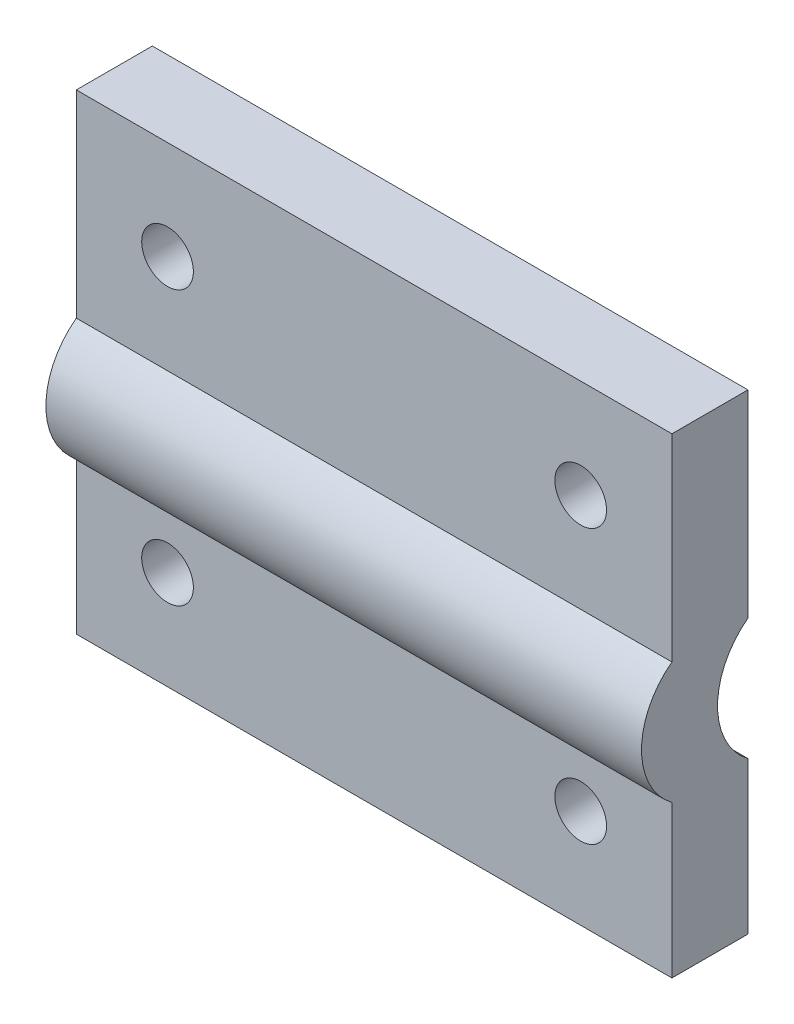
ISO-10303-21;
HEADER;
FILE_DESCRIPTION(('STEP AP214'),'2;1');
FILE_NAME('part.step','',(''),(''),'','','');
FILE_SCHEMA(('AUTOMOTIVE_DESIGN { 1 0 10303 214 1 1 1 1 }'));
ENDSEC;
DATA;
#1=APPLICATION_CONTEXT('core data for automotive mechanical design processes');
#2=APPLICATION_PROTOCOL_DEFINITION('international standard','automotive_design',2000,#1);
#3=PRODUCT_CONTEXT('',#1,'mechanical');
#4=PRODUCT('Part','Part','',(#3));
#5=PRODUCT_RELATED_PRODUCT_CATEGORY('part','',(#4));
#6=PRODUCT_DEFINITION_FORMATION('','',#4);
#7=PRODUCT_DEFINITION_CONTEXT('part definition',#1,'design');
#8=PRODUCT_DEFINITION('design','',#6,#7);
#9=PRODUCT_DEFINITION_SHAPE('','',#8);
#10=(LENGTH_UNIT() NAMED_UNIT(*) SI_UNIT(.MILLI.,.METRE.));
#11=(NAMED_UNIT(*) PLANE_ANGLE_UNIT() SI_UNIT($,.RADIAN.));
#12=(NAMED_UNIT(*) SI_UNIT($,.STERADIAN.) SOLID_ANGLE_UNIT());
#13=UNCERTAINTY_MEASURE_WITH_UNIT(LENGTH_MEASURE(1.E-05),#10,'distance_accuracy_value','');
#14=(GEOMETRIC_REPRESENTATION_CONTEXT(3) GLOBAL_UNCERTAINTY_ASSIGNED_CONTEXT((#13)) GLOBAL_UNIT_ASSIGNED_CONTEXT((#10,
#11,#12)) REPRESENTATION_CONTEXT('',''));
#15=CARTESIAN_POINT('',(0.,0.,0.));
#16=DIRECTION('',(0.,0.,1.));
#17=DIRECTION('',(1.,0.,0.));
#18=AXIS2_PLACEMENT_3D('',#15,#16,#17);
#19=CARTESIAN_POINT('',(-20.5399999999997,0.,5.));
#20=DIRECTION('',(1.,0.,0.));
#21=DIRECTION('',(0.,1.,0.));
#22=AXIS2_PLACEMENT_3D('',#19,#20,#21);
#23=PLANE('',#22);
#24=DIRECTION('',(0.,-1.,0.));
#25=VECTOR('',#24,1.);
#26=CARTESIAN_POINT('',(-20.5399999999997,0.,0.));
#27=LINE('',#26,#25);
#28=CARTESIAN_POINT('',(-20.5399999999997,52.1440002712051,0.));
#29=VERTEX_POINT('',#28);
#30=CARTESIAN_POINT('',(-20.5399999999997,39.1440002712051,0.));
#31=VERTEX_POINT('',#30);
#32=EDGE_CURVE('E20',#29,#31,#27,.T.);
#33=ORIENTED_EDGE('',*,*,#32,.T.);
#34=CARTESIAN_POINT('',(-20.5399999999997,35.144000271205,-3.));
#35=DIRECTION('',(-1.,0.,0.));
#36=DIRECTION('',(0.,-1.,0.));
#37=AXIS2_PLACEMENT_3D('',#34,#35,#36);
#38=CIRCLE('',#37,5.);
#39=CARTESIAN_POINT('',(-20.5399999999997,31.144000271205,0.));
#40=VERTEX_POINT('',#39);
#41=EDGE_CURVE('E110',#31,#40,#38,.F.);
#42=ORIENTED_EDGE('',*,*,#41,.T.);
#43=DIRECTION('',(0.,-1.,0.));
#44=VECTOR('',#43,1.);
#45=CARTESIAN_POINT('',(-20.5399999999997,0.,0.));
#46=LINE('',#45,#44);
#47=CARTESIAN_POINT('',(-20.5399999999997,21.1440002712051,0.));
#48=VERTEX_POINT('',#47);
#49=EDGE_CURVE('E299',#40,#48,#46,.T.);
#50=ORIENTED_EDGE('',*,*,#49,.T.);
#51=DIRECTION('',(0.,0.,-1.));
#52=VECTOR('',#51,1.);
#53=CARTESIAN_POINT('',(-20.5399999999997,21.1440002712051,5.));
#54=LINE('',#53,#52);
#55=CARTESIAN_POINT('',(-20.5399999999997,21.1440002712051,5.));
#56=VERTEX_POINT('',#55);
#57=EDGE_CURVE('E104',#56,#48,#54,.T.);
#58=ORIENTED_EDGE('',*,*,#57,.F.);
#59=DIRECTION('',(0.,-1.,0.));
#60=VECTOR('',#59,1.);
#61=CARTESIAN_POINT('',(-20.5399999999997,0.,5.));
#62=LINE('',#61,#60);
#63=CARTESIAN_POINT('',(-20.5399999999997,31.144000271205,5.));
#64=VERTEX_POINT('',#63);
#65=EDGE_CURVE('E87',#64,#56,#62,.T.);
#66=ORIENTED_EDGE('',*,*,#65,.F.);
#67=CARTESIAN_POINT('',(-20.5399999999997,35.144000271205,2.));
#68=DIRECTION('',(-1.,0.,0.));
#69=DIRECTION('',(0.,-1.,0.));
#70=AXIS2_PLACEMENT_3D('',#67,#68,#69);
#71=CIRCLE('',#70,5.);
#72=CARTESIAN_POINT('',(-20.5399999999997,39.1440002712051,5.));
#73=VERTEX_POINT('',#72);
#74=EDGE_CURVE('E101',#73,#64,#71,.F.);
#75=ORIENTED_EDGE('',*,*,#74,.F.);
#76=DIRECTION('',(0.,-1.,0.));
#77=VECTOR('',#76,1.);
#78=CARTESIAN_POINT('',(-20.5399999999997,0.,5.));
#79=LINE('',#78,#77);
#80=CARTESIAN_POINT('',(-20.5399999999997,52.1440002712051,5.));
#81=VERTEX_POINT('',#80);
#82=EDGE_CURVE('E139',#81,#73,#79,.T.);
#83=ORIENTED_EDGE('',*,*,#82,.F.);
#84=DIRECTION('',(0.,0.,-1.));
#85=VECTOR('',#84,1.);
#86=CARTESIAN_POINT('',(-20.5399999999997,52.1440002712051,5.));
#87=LINE('',#86,#85);
#88=EDGE_CURVE('E42',#81,#29,#87,.T.);
#89=ORIENTED_EDGE('',*,*,#88,.T.);
#90=EDGE_LOOP('',(#33,#42,#50,#58,#66,#75,#83,#89));
#91=FACE_BOUND('',#90,.T.);
#92=ADVANCED_FACE('F17',(#91),#23,.F.);
#93=CARTESIAN_POINT('',(18.6350000000003,0.,5.));
#94=DIRECTION('',(-1.,0.,0.));
#95=DIRECTION('',(0.,0.,1.));
#96=AXIS2_PLACEMENT_3D('',#93,#94,#95);
#97=PLANE('',#96);
#98=DIRECTION('',(0.,1.,0.));
#99=VECTOR('',#98,1.);
#100=CARTESIAN_POINT('',(18.6350000000003,0.,5.));
#101=LINE('',#100,#99);
#102=CARTESIAN_POINT('',(18.6350000000003,39.1440002712051,5.));
#103=VERTEX_POINT('',#102);
#104=CARTESIAN_POINT('',(18.6350000000003,52.1440002712051,5.));
#105=VERTEX_POINT('',#104);
#106=EDGE_CURVE('E143',#103,#105,#101,.T.);
#107=ORIENTED_EDGE('',*,*,#106,.F.);
#108=CARTESIAN_POINT('',(18.6350000000003,35.144000271205,2.));
#109=DIRECTION('',(-1.,0.,0.));
#110=DIRECTION('',(0.,0.,1.));
#111=AXIS2_PLACEMENT_3D('',#108,#109,#110);
#112=CIRCLE('',#111,5.);
#113=CARTESIAN_POINT('',(18.6350000000003,31.144000271205,5.));
#114=VERTEX_POINT('',#113);
#115=EDGE_CURVE('E94',#114,#103,#112,.T.);
#116=ORIENTED_EDGE('',*,*,#115,.F.);
#117=DIRECTION('',(0.,1.,0.));
#118=VECTOR('',#117,1.);
#119=CARTESIAN_POINT('',(18.6350000000003,0.,5.));
#120=LINE('',#119,#118);
#121=CARTESIAN_POINT('',(18.6350000000003,21.1440002712051,5.));
#122=VERTEX_POINT('',#121);
#123=EDGE_CURVE('E90',#122,#114,#120,.T.);
#124=ORIENTED_EDGE('',*,*,#123,.F.);
#125=DIRECTION('',(0.,0.,-1.));
#126=VECTOR('',#125,1.);
#127=CARTESIAN_POINT('',(18.6350000000003,21.1440002712051,5.));
#128=LINE('',#127,#126);
#129=CARTESIAN_POINT('',(18.6350000000003,21.1440002712051,0.));
#130=VERTEX_POINT('',#129);
#131=EDGE_CURVE('E306',#122,#130,#128,.T.);
#132=ORIENTED_EDGE('',*,*,#131,.T.);
#133=DIRECTION('',(0.,1.,0.));
#134=VECTOR('',#133,1.);
#135=CARTESIAN_POINT('',(18.6350000000003,0.,0.));
#136=LINE('',#135,#134);
#137=CARTESIAN_POINT('',(18.6350000000003,31.144000271205,0.));
#138=VERTEX_POINT('',#137);
#139=EDGE_CURVE('E106',#130,#138,#136,.T.);
#140=ORIENTED_EDGE('',*,*,#139,.T.);
#141=CARTESIAN_POINT('',(18.6350000000003,35.144000271205,-3.));
#142=DIRECTION('',(-1.,0.,0.));
#143=DIRECTION('',(0.,0.,1.));
#144=AXIS2_PLACEMENT_3D('',#141,#142,#143);
#145=CIRCLE('',#144,5.);
#146=CARTESIAN_POINT('',(18.6350000000003,39.1440002712051,0.));
#147=VERTEX_POINT('',#146);
#148=EDGE_CURVE('E118',#138,#147,#145,.T.);
#149=ORIENTED_EDGE('',*,*,#148,.T.);
#150=DIRECTION('',(0.,1.,0.));
#151=VECTOR('',#150,1.);
#152=CARTESIAN_POINT('',(18.6350000000003,0.,0.));
#153=LINE('',#152,#151);
#154=CARTESIAN_POINT('',(18.6350000000003,52.1440002712051,0.));
#155=VERTEX_POINT('',#154);
#156=EDGE_CURVE('E134',#147,#155,#153,.T.);
#157=ORIENTED_EDGE('',*,*,#156,.T.);
#158=DIRECTION('',(0.,0.,-1.));
#159=VECTOR('',#158,1.);
#160=CARTESIAN_POINT('',(18.6350000000003,52.1440002712051,5.));
#161=LINE('',#160,#159);
#162=EDGE_CURVE('E120',#105,#155,#161,.T.);
#163=ORIENTED_EDGE('',*,*,#162,.F.);
#164=EDGE_LOOP('',(#107,#116,#124,#132,#140,#149,#157,#163));
#165=FACE_BOUND('',#164,.T.);
#166=ADVANCED_FACE('F154',(#165),#97,.F.);
#167=CARTESIAN_POINT('',(0.,0.,5.));
#168=DIRECTION('',(0.,0.,1.));
#169=DIRECTION('',(1.,0.,0.));
#170=AXIS2_PLACEMENT_3D('',#167,#168,#169);
#171=PLANE('',#170);
#172=CARTESIAN_POINT('',(-14.5399999999997,45.6440002712051,5.));
#173=DIRECTION('',(0.,0.,-1.));
#174=DIRECTION('',(-1.,0.,0.));
#175=AXIS2_PLACEMENT_3D('',#172,#173,#174);
#176=CIRCLE('',#175,1.7);
#177=CARTESIAN_POINT('',(-16.2399999999997,45.6440002712051,5.));
#178=VERTEX_POINT('',#177);
#179=EDGE_CURVE('E130',#178,#178,#176,.T.);
#180=ORIENTED_EDGE('',*,*,#179,.T.);
#181=EDGE_LOOP('',(#180));
#182=FACE_BOUND('',#181,.T.);
#183=CARTESIAN_POINT('',(12.6350000000003,45.6440002712051,5.));
#184=DIRECTION('',(0.,0.,-1.));
#185=DIRECTION('',(-1.,0.,0.));
#186=AXIS2_PLACEMENT_3D('',#183,#184,#185);
#187=CIRCLE('',#186,1.7);
#188=CARTESIAN_POINT('',(10.9350000000003,45.6440002712051,5.));
#189=VERTEX_POINT('',#188);
#190=EDGE_CURVE('E133',#189,#189,#187,.T.);
#191=ORIENTED_EDGE('',*,*,#190,.T.);
#192=EDGE_LOOP('',(#191));
#193=FACE_BOUND('',#192,.T.);
#194=ORIENTED_EDGE('',*,*,#82,.T.);
#195=DIRECTION('',(-1.,0.,0.));
#196=VECTOR('',#195,1.);
#197=CARTESIAN_POINT('',(18.6360000000003,39.1440002712051,5.));
#198=LINE('',#197,#196);
#199=EDGE_CURVE('E11',#103,#73,#198,.T.);
#200=ORIENTED_EDGE('',*,*,#199,.F.);
#201=ORIENTED_EDGE('',*,*,#106,.T.);
#202=DIRECTION('',(1.,0.,0.));
#203=VECTOR('',#202,1.);
#204=CARTESIAN_POINT('',(0.,52.1440002712051,5.));
#205=LINE('',#204,#203);
#206=EDGE_CURVE('E124',#81,#105,#205,.T.);
#207=ORIENTED_EDGE('',*,*,#206,.F.);
#208=EDGE_LOOP('',(#194,#200,#201,#207));
#209=FACE_BOUND('',#208,.T.);
#210=ADVANCED_FACE('F156',(#182,#193,#209),#171,.T.);
#211=CARTESIAN_POINT('',(0.,0.,0.));
#212=DIRECTION('',(0.,0.,1.));
#213=DIRECTION('',(1.,0.,0.));
#214=AXIS2_PLACEMENT_3D('',#211,#212,#213);
#215=PLANE('',#214);
#216=CARTESIAN_POINT('',(12.6350000000003,45.6440002712051,0.));
#217=DIRECTION('',(0.,0.,-1.));
#218=DIRECTION('',(-1.,0.,0.));
#219=AXIS2_PLACEMENT_3D('',#216,#217,#218);
#220=CIRCLE('',#219,1.7);
#221=CARTESIAN_POINT('',(10.9350000000003,45.6440002712051,0.));
#222=VERTEX_POINT('',#221);
#223=EDGE_CURVE('E25',#222,#222,#220,.T.);
#224=ORIENTED_EDGE('',*,*,#223,.F.);
#225=EDGE_LOOP('',(#224));
#226=FACE_BOUND('',#225,.T.);
#227=CARTESIAN_POINT('',(-14.5399999999997,45.6440002712051,0.));
#228=DIRECTION('',(0.,0.,-1.));
#229=DIRECTION('',(-1.,0.,0.));
#230=AXIS2_PLACEMENT_3D('',#227,#228,#229);
#231=CIRCLE('',#230,1.7);
#232=CARTESIAN_POINT('',(-16.2399999999997,45.6440002712051,0.));
#233=VERTEX_POINT('',#232);
#234=EDGE_CURVE('E123',#233,#233,#231,.T.);
#235=ORIENTED_EDGE('',*,*,#234,.F.);
#236=EDGE_LOOP('',(#235));
#237=FACE_BOUND('',#236,.T.);
#238=DIRECTION('',(-1.,0.,0.));
#239=VECTOR('',#238,1.);
#240=CARTESIAN_POINT('',(18.6360000000003,39.1440002712051,0.));
#241=LINE('',#240,#239);
#242=EDGE_CURVE('E33',#147,#31,#241,.T.);
#243=ORIENTED_EDGE('',*,*,#242,.T.);
#244=ORIENTED_EDGE('',*,*,#32,.F.);
#245=DIRECTION('',(1.,0.,0.));
#246=VECTOR('',#245,1.);
#247=CARTESIAN_POINT('',(0.,52.1440002712051,0.));
#248=LINE('',#247,#246);
#249=EDGE_CURVE('E126',#29,#155,#248,.T.);
#250=ORIENTED_EDGE('',*,*,#249,.T.);
#251=ORIENTED_EDGE('',*,*,#156,.F.);
#252=EDGE_LOOP('',(#243,#244,#250,#251));
#253=FACE_BOUND('',#252,.T.);
#254=ADVANCED_FACE('F150',(#226,#237,#253),#215,.F.);
#255=CARTESIAN_POINT('',(0.,52.1440002712051,5.));
#256=DIRECTION('',(0.,1.,0.));
#257=DIRECTION('',(0.,0.,1.));
#258=AXIS2_PLACEMENT_3D('',#255,#256,#257);
#259=PLANE('',#258);
#260=ORIENTED_EDGE('',*,*,#249,.F.);
#261=ORIENTED_EDGE('',*,*,#88,.F.);
#262=ORIENTED_EDGE('',*,*,#206,.T.);
#263=ORIENTED_EDGE('',*,*,#162,.T.);
#264=EDGE_LOOP('',(#260,#261,#262,#263));
#265=FACE_BOUND('',#264,.T.);
#266=ADVANCED_FACE('F151',(#265),#259,.T.);
#267=CARTESIAN_POINT('',(-14.5399999999997,45.6440002712051,0.));
#268=DIRECTION('',(0.,0.,-1.));
#269=DIRECTION('',(-1.,0.,0.));
#270=AXIS2_PLACEMENT_3D('',#267,#268,#269);
#271=CYLINDRICAL_SURFACE('',#270,1.7);
#272=ORIENTED_EDGE('',*,*,#179,.F.);
#273=EDGE_LOOP('',(#272));
#274=FACE_BOUND('',#273,.T.);
#275=ORIENTED_EDGE('',*,*,#234,.T.);
#276=EDGE_LOOP('',(#275));
#277=FACE_BOUND('',#276,.T.);
#278=ADVANCED_FACE('F204',(#274,#277),#271,.F.);
#279=CARTESIAN_POINT('',(12.6350000000003,45.6440002712051,0.));
#280=DIRECTION('',(0.,0.,-1.));
#281=DIRECTION('',(-1.,0.,0.));
#282=AXIS2_PLACEMENT_3D('',#279,#280,#281);
#283=CYLINDRICAL_SURFACE('',#282,1.7);
#284=ORIENTED_EDGE('',*,*,#190,.F.);
#285=EDGE_LOOP('',(#284));
#286=FACE_BOUND('',#285,.T.);
#287=ORIENTED_EDGE('',*,*,#223,.T.);
#288=EDGE_LOOP('',(#287));
#289=FACE_BOUND('',#288,.T.);
#290=ADVANCED_FACE('F211',(#286,#289),#283,.F.);
#291=CARTESIAN_POINT('',(29.2651458127349,35.144000271205,2.));
#292=DIRECTION('',(-1.,0.,0.));
#293=DIRECTION('',(0.,-1.,0.));
#294=AXIS2_PLACEMENT_3D('',#291,#292,#293);
#295=CYLINDRICAL_SURFACE('',#294,5.);
#296=DIRECTION('',(-1.,0.,0.));
#297=VECTOR('',#296,1.);
#298=CARTESIAN_POINT('',(29.2651458127349,31.144000271205,5.));
#299=LINE('',#298,#297);
#300=EDGE_CURVE('E83',#114,#64,#299,.T.);
#301=ORIENTED_EDGE('',*,*,#300,.F.);
#302=ORIENTED_EDGE('',*,*,#115,.T.);
#303=ORIENTED_EDGE('',*,*,#199,.T.);
#304=ORIENTED_EDGE('',*,*,#74,.T.);
#305=EDGE_LOOP('',(#301,#302,#303,#304));
#306=FACE_BOUND('',#305,.T.);
#307=ADVANCED_FACE('F108',(#306),#295,.T.);
#308=CARTESIAN_POINT('',(29.2651458127349,35.144000271205,-3.));
#309=DIRECTION('',(-1.,0.,0.));
#310=DIRECTION('',(0.,-1.,0.));
#311=AXIS2_PLACEMENT_3D('',#308,#309,#310);
#312=CYLINDRICAL_SURFACE('',#311,5.);
#313=ORIENTED_EDGE('',*,*,#148,.F.);
#314=DIRECTION('',(-1.,0.,0.));
#315=VECTOR('',#314,1.);
#316=CARTESIAN_POINT('',(29.2651458127349,31.144000271205,0.));
#317=LINE('',#316,#315);
#318=EDGE_CURVE('E95',#138,#40,#317,.T.);
#319=ORIENTED_EDGE('',*,*,#318,.T.);
#320=ORIENTED_EDGE('',*,*,#41,.F.);
#321=ORIENTED_EDGE('',*,*,#242,.F.);
#322=EDGE_LOOP('',(#313,#319,#320,#321));
#323=FACE_BOUND('',#322,.T.);
#324=ADVANCED_FACE('F227',(#323),#312,.F.);
#325=CARTESIAN_POINT('',(0.,21.1440002712051,5.));
#326=DIRECTION('',(0.,1.,0.));
#327=DIRECTION('',(0.,0.,1.));
#328=AXIS2_PLACEMENT_3D('',#325,#326,#327);
#329=PLANE('',#328);
#330=DIRECTION('',(1.,0.,0.));
#331=VECTOR('',#330,1.);
#332=CARTESIAN_POINT('',(0.,21.1440002712051,0.));
#333=LINE('',#332,#331);
#334=EDGE_CURVE('E302',#48,#130,#333,.T.);
#335=ORIENTED_EDGE('',*,*,#334,.T.);
#336=ORIENTED_EDGE('',*,*,#131,.F.);
#337=DIRECTION('',(1.,0.,0.));
#338=VECTOR('',#337,1.);
#339=CARTESIAN_POINT('',(0.,21.1440002712051,5.));
#340=LINE('',#339,#338);
#341=EDGE_CURVE('E105',#56,#122,#340,.T.);
#342=ORIENTED_EDGE('',*,*,#341,.F.);
#343=ORIENTED_EDGE('',*,*,#57,.T.);
#344=EDGE_LOOP('',(#335,#336,#342,#343));
#345=FACE_BOUND('',#344,.T.);
#346=ADVANCED_FACE('F235',(#345),#329,.F.);
#347=CARTESIAN_POINT('',(12.6350000000003,27.6440002712051,5.));
#348=DIRECTION('',(0.,0.,1.));
#349=DIRECTION('',(1.,0.,0.));
#350=AXIS2_PLACEMENT_3D('',#347,#348,#349);
#351=CYLINDRICAL_SURFACE('',#350,1.7);
#352=CARTESIAN_POINT('',(12.6350000000003,27.6440002712051,0.));
#353=DIRECTION('',(0.,0.,1.));
#354=DIRECTION('',(1.,0.,0.));
#355=AXIS2_PLACEMENT_3D('',#352,#353,#354);
#356=CIRCLE('',#355,1.7);
#357=CARTESIAN_POINT('',(14.3350000000003,27.6440002712051,0.));
#358=VERTEX_POINT('',#357);
#359=EDGE_CURVE('E297',#358,#358,#356,.T.);
#360=ORIENTED_EDGE('',*,*,#359,.F.);
#361=EDGE_LOOP('',(#360));
#362=FACE_BOUND('',#361,.T.);
#363=CARTESIAN_POINT('',(12.6350000000003,27.6440002712051,5.));
#364=DIRECTION('',(0.,0.,1.));
#365=DIRECTION('',(1.,0.,0.));
#366=AXIS2_PLACEMENT_3D('',#363,#364,#365);
#367=CIRCLE('',#366,1.7);
#368=CARTESIAN_POINT('',(14.3350000000003,27.6440002712051,5.));
#369=VERTEX_POINT('',#368);
#370=EDGE_CURVE('E315',#369,#369,#367,.T.);
#371=ORIENTED_EDGE('',*,*,#370,.T.);
#372=EDGE_LOOP('',(#371));
#373=FACE_BOUND('',#372,.T.);
#374=ADVANCED_FACE('F243',(#362,#373),#351,.F.);
#375=CARTESIAN_POINT('',(-14.5399999999997,27.6440002712051,5.));
#376=DIRECTION('',(0.,0.,1.));
#377=DIRECTION('',(1.,0.,0.));
#378=AXIS2_PLACEMENT_3D('',#375,#376,#377);
#379=CYLINDRICAL_SURFACE('',#378,1.7);
#380=CARTESIAN_POINT('',(-14.5399999999997,27.6440002712051,0.));
#381=DIRECTION('',(0.,0.,1.));
#382=DIRECTION('',(1.,0.,0.));
#383=AXIS2_PLACEMENT_3D('',#380,#381,#382);
#384=CIRCLE('',#383,1.7);
#385=CARTESIAN_POINT('',(-12.8399999999997,27.6440002712051,0.));
#386=VERTEX_POINT('',#385);
#387=EDGE_CURVE('E293',#386,#386,#384,.T.);
#388=ORIENTED_EDGE('',*,*,#387,.F.);
#389=EDGE_LOOP('',(#388));
#390=FACE_BOUND('',#389,.T.);
#391=CARTESIAN_POINT('',(-14.5399999999997,27.6440002712051,5.));
#392=DIRECTION('',(0.,0.,1.));
#393=DIRECTION('',(1.,0.,0.));
#394=AXIS2_PLACEMENT_3D('',#391,#392,#393);
#395=CIRCLE('',#394,1.7);
#396=CARTESIAN_POINT('',(-12.8399999999997,27.6440002712051,5.));
#397=VERTEX_POINT('',#396);
#398=EDGE_CURVE('E319',#397,#397,#395,.T.);
#399=ORIENTED_EDGE('',*,*,#398,.T.);
#400=EDGE_LOOP('',(#399));
#401=FACE_BOUND('',#400,.T.);
#402=ADVANCED_FACE('F252',(#390,#401),#379,.F.);
#403=CARTESIAN_POINT('',(0.,0.,5.));
#404=DIRECTION('',(0.,0.,1.));
#405=DIRECTION('',(1.,0.,0.));
#406=AXIS2_PLACEMENT_3D('',#403,#404,#405);
#407=PLANE('',#406);
#408=ORIENTED_EDGE('',*,*,#300,.T.);
#409=ORIENTED_EDGE('',*,*,#65,.T.);
#410=ORIENTED_EDGE('',*,*,#341,.T.);
#411=ORIENTED_EDGE('',*,*,#123,.T.);
#412=EDGE_LOOP('',(#408,#409,#410,#411));
#413=FACE_BOUND('',#412,.T.);
#414=ORIENTED_EDGE('',*,*,#398,.F.);
#415=EDGE_LOOP('',(#414));
#416=FACE_BOUND('',#415,.T.);
#417=ORIENTED_EDGE('',*,*,#370,.F.);
#418=EDGE_LOOP('',(#417));
#419=FACE_BOUND('',#418,.T.);
#420=ADVANCED_FACE('F85',(#413,#416,#419),#407,.T.);
#421=CARTESIAN_POINT('',(0.,0.,0.));
#422=DIRECTION('',(0.,0.,1.));
#423=DIRECTION('',(1.,0.,0.));
#424=AXIS2_PLACEMENT_3D('',#421,#422,#423);
#425=PLANE('',#424);
#426=ORIENTED_EDGE('',*,*,#387,.T.);
#427=EDGE_LOOP('',(#426));
#428=FACE_BOUND('',#427,.T.);
#429=ORIENTED_EDGE('',*,*,#359,.T.);
#430=EDGE_LOOP('',(#429));
#431=FACE_BOUND('',#430,.T.);
#432=ORIENTED_EDGE('',*,*,#49,.F.);
#433=ORIENTED_EDGE('',*,*,#318,.F.);
#434=ORIENTED_EDGE('',*,*,#139,.F.);
#435=ORIENTED_EDGE('',*,*,#334,.F.);
#436=EDGE_LOOP('',(#432,#433,#434,#435));
#437=FACE_BOUND('',#436,.T.);
#438=ADVANCED_FACE('F269',(#428,#431,#437),#425,.F.);
#439=CLOSED_SHELL('',(#92,#166,#210,#254,#266,#278,#290,#307,#324,#346,#374,#402,#420,#438));
#440=MANIFOLD_SOLID_BREP('B1',#439);
#441=ADVANCED_BREP_SHAPE_REPRESENTATION('',(#18,#440),#14);
#442=SHAPE_DEFINITION_REPRESENTATION(#9,#441);
ENDSEC;
END-ISO-10303-21;
